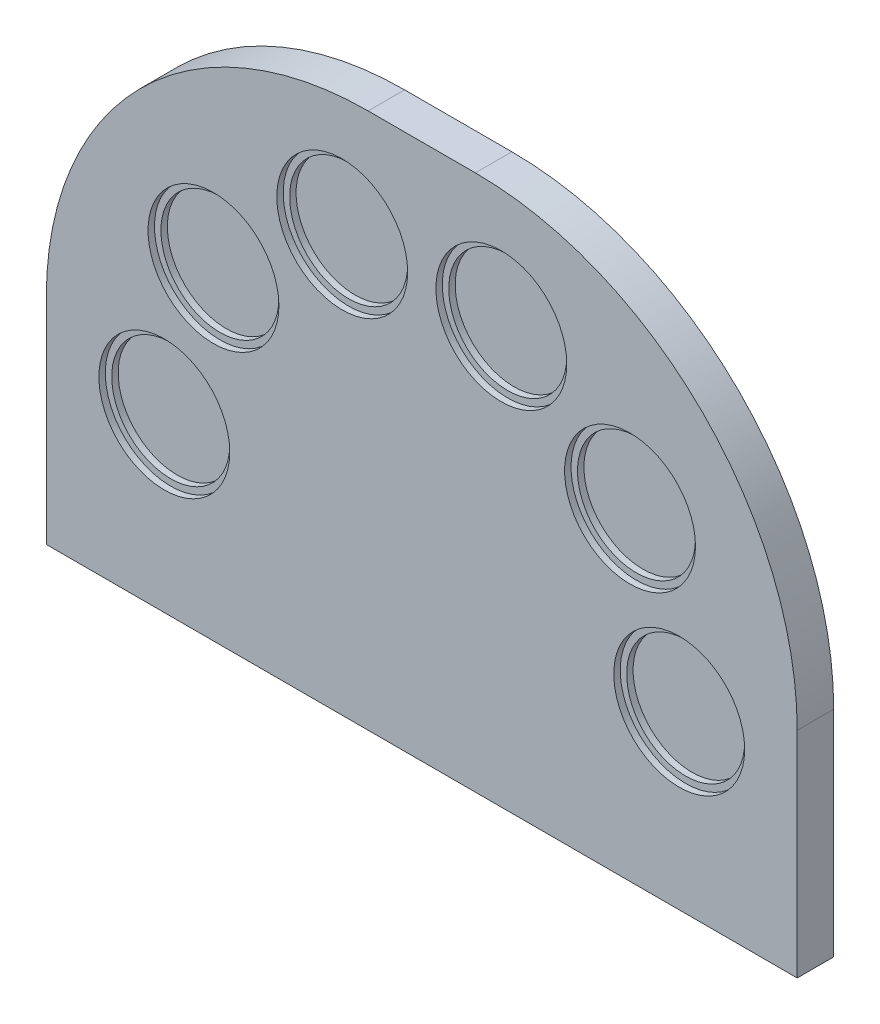
ISO-10303-21;
HEADER;
FILE_DESCRIPTION(('STEP AP214'),'2;1');
FILE_NAME('part.step','',(''),(''),'','','');
FILE_SCHEMA(('AUTOMOTIVE_DESIGN { 1 0 10303 214 1 1 1 1 }'));
ENDSEC;
DATA;
#1=APPLICATION_CONTEXT('core data for automotive mechanical design processes');
#2=APPLICATION_PROTOCOL_DEFINITION('international standard','automotive_design',2000,#1);
#3=PRODUCT_CONTEXT('',#1,'mechanical');
#4=PRODUCT('Part','Part','',(#3));
#5=PRODUCT_RELATED_PRODUCT_CATEGORY('part','',(#4));
#6=PRODUCT_DEFINITION_FORMATION('','',#4);
#7=PRODUCT_DEFINITION_CONTEXT('part definition',#1,'design');
#8=PRODUCT_DEFINITION('design','',#6,#7);
#9=PRODUCT_DEFINITION_SHAPE('','',#8);
#10=(LENGTH_UNIT() NAMED_UNIT(*) SI_UNIT(.MILLI.,.METRE.));
#11=(NAMED_UNIT(*) PLANE_ANGLE_UNIT() SI_UNIT($,.RADIAN.));
#12=(NAMED_UNIT(*) SI_UNIT($,.STERADIAN.) SOLID_ANGLE_UNIT());
#13=UNCERTAINTY_MEASURE_WITH_UNIT(LENGTH_MEASURE(1.E-05),#10,'distance_accuracy_value','');
#14=(GEOMETRIC_REPRESENTATION_CONTEXT(3) GLOBAL_UNCERTAINTY_ASSIGNED_CONTEXT((#13)) GLOBAL_UNIT_ASSIGNED_CONTEXT((#10,
#11,#12)) REPRESENTATION_CONTEXT('',''));
#15=CARTESIAN_POINT('',(0.,0.,0.));
#16=DIRECTION('',(0.,0.,1.));
#17=DIRECTION('',(1.,0.,0.));
#18=AXIS2_PLACEMENT_3D('',#15,#16,#17);
#19=CARTESIAN_POINT('',(0.,125.,14.));
#20=DIRECTION('',(-1.,0.,0.));
#21=DIRECTION('',(0.,0.,1.));
#22=AXIS2_PLACEMENT_3D('',#19,#20,#21);
#23=PLANE('',#22);
#24=DIRECTION('',(0.,0.,-1.));
#25=VECTOR('',#24,1.);
#26=CARTESIAN_POINT('',(0.,0.,14.));
#27=LINE('',#26,#25);
#28=CARTESIAN_POINT('',(0.,0.,17.));
#29=VERTEX_POINT('',#28);
#30=CARTESIAN_POINT('',(0.,0.,0.));
#31=VERTEX_POINT('',#30);
#32=EDGE_CURVE('E131',#29,#31,#27,.T.);
#33=ORIENTED_EDGE('',*,*,#32,.F.);
#34=DIRECTION('',(0.,1.,0.));
#35=VECTOR('',#34,1.);
#36=CARTESIAN_POINT('',(0.,125.,17.));
#37=LINE('',#36,#35);
#38=CARTESIAN_POINT('',(0.,100.,17.));
#39=VERTEX_POINT('',#38);
#40=EDGE_CURVE('E147',#29,#39,#37,.T.);
#41=ORIENTED_EDGE('',*,*,#40,.T.);
#42=DIRECTION('',(0.,0.,-1.));
#43=VECTOR('',#42,1.);
#44=CARTESIAN_POINT('',(0.,100.,14.));
#45=LINE('',#44,#43);
#46=CARTESIAN_POINT('',(0.,100.,0.));
#47=VERTEX_POINT('',#46);
#48=EDGE_CURVE('E10',#39,#47,#45,.T.);
#49=ORIENTED_EDGE('',*,*,#48,.T.);
#50=DIRECTION('',(0.,1.,0.));
#51=VECTOR('',#50,1.);
#52=CARTESIAN_POINT('',(0.,125.,0.));
#53=LINE('',#52,#51);
#54=EDGE_CURVE('E277',#31,#47,#53,.T.);
#55=ORIENTED_EDGE('',*,*,#54,.F.);
#56=EDGE_LOOP('',(#33,#41,#49,#55));
#57=FACE_BOUND('',#56,.T.);
#58=ADVANCED_FACE('F16',(#57),#23,.T.);
#59=CARTESIAN_POINT('',(175.,0.,14.));
#60=DIRECTION('',(0.,1.,0.));
#61=DIRECTION('',(0.,0.,1.));
#62=AXIS2_PLACEMENT_3D('',#59,#60,#61);
#63=PLANE('',#62);
#64=DIRECTION('',(1.,0.,0.));
#65=VECTOR('',#64,1.);
#66=CARTESIAN_POINT('',(175.,0.,0.));
#67=LINE('',#66,#65);
#68=CARTESIAN_POINT('',(350.,0.,0.));
#69=VERTEX_POINT('',#68);
#70=EDGE_CURVE('E126',#31,#69,#67,.T.);
#71=ORIENTED_EDGE('',*,*,#70,.T.);
#72=DIRECTION('',(0.,0.,-1.));
#73=VECTOR('',#72,1.);
#74=CARTESIAN_POINT('',(350.,0.,14.));
#75=LINE('',#74,#73);
#76=CARTESIAN_POINT('',(350.,0.,17.));
#77=VERTEX_POINT('',#76);
#78=EDGE_CURVE('E119',#77,#69,#75,.T.);
#79=ORIENTED_EDGE('',*,*,#78,.F.);
#80=DIRECTION('',(1.,0.,0.));
#81=VECTOR('',#80,1.);
#82=CARTESIAN_POINT('',(175.,0.,17.));
#83=LINE('',#82,#81);
#84=EDGE_CURVE('E123',#29,#77,#83,.T.);
#85=ORIENTED_EDGE('',*,*,#84,.F.);
#86=ORIENTED_EDGE('',*,*,#32,.T.);
#87=EDGE_LOOP('',(#71,#79,#85,#86));
#88=FACE_BOUND('',#87,.T.);
#89=ADVANCED_FACE('F121',(#88),#63,.F.);
#90=CARTESIAN_POINT('',(350.,125.,14.));
#91=DIRECTION('',(-1.,0.,0.));
#92=DIRECTION('',(0.,0.,1.));
#93=AXIS2_PLACEMENT_3D('',#90,#91,#92);
#94=PLANE('',#93);
#95=DIRECTION('',(0.,1.,0.));
#96=VECTOR('',#95,1.);
#97=CARTESIAN_POINT('',(350.,125.,0.));
#98=LINE('',#97,#96);
#99=CARTESIAN_POINT('',(350.,100.,0.));
#100=VERTEX_POINT('',#99);
#101=EDGE_CURVE('E286',#69,#100,#98,.T.);
#102=ORIENTED_EDGE('',*,*,#101,.T.);
#103=DIRECTION('',(0.,0.,-1.));
#104=VECTOR('',#103,1.);
#105=CARTESIAN_POINT('',(350.,100.,14.));
#106=LINE('',#105,#104);
#107=CARTESIAN_POINT('',(350.,100.,17.));
#108=VERTEX_POINT('',#107);
#109=EDGE_CURVE('E25',#100,#108,#106,.F.);
#110=ORIENTED_EDGE('',*,*,#109,.T.);
#111=DIRECTION('',(0.,1.,0.));
#112=VECTOR('',#111,1.);
#113=CARTESIAN_POINT('',(350.,125.,17.));
#114=LINE('',#113,#112);
#115=EDGE_CURVE('E135',#77,#108,#114,.T.);
#116=ORIENTED_EDGE('',*,*,#115,.F.);
#117=ORIENTED_EDGE('',*,*,#78,.T.);
#118=EDGE_LOOP('',(#102,#110,#116,#117));
#119=FACE_BOUND('',#118,.T.);
#120=ADVANCED_FACE('F136',(#119),#94,.F.);
#121=CARTESIAN_POINT('',(175.,250.,14.));
#122=DIRECTION('',(0.,1.,0.));
#123=DIRECTION('',(0.,0.,1.));
#124=AXIS2_PLACEMENT_3D('',#121,#122,#123);
#125=PLANE('',#124);
#126=DIRECTION('',(0.,0.,-1.));
#127=VECTOR('',#126,1.);
#128=CARTESIAN_POINT('',(150.,250.,14.));
#129=LINE('',#128,#127);
#130=CARTESIAN_POINT('',(150.,250.,0.));
#131=VERTEX_POINT('',#130);
#132=CARTESIAN_POINT('',(150.,250.,17.));
#133=VERTEX_POINT('',#132);
#134=EDGE_CURVE('E294',#131,#133,#129,.F.);
#135=ORIENTED_EDGE('',*,*,#134,.T.);
#136=DIRECTION('',(1.,0.,0.));
#137=VECTOR('',#136,1.);
#138=CARTESIAN_POINT('',(175.,250.,17.));
#139=LINE('',#138,#137);
#140=CARTESIAN_POINT('',(200.,250.,17.));
#141=VERTEX_POINT('',#140);
#142=EDGE_CURVE('E161',#133,#141,#139,.T.);
#143=ORIENTED_EDGE('',*,*,#142,.T.);
#144=DIRECTION('',(0.,0.,-1.));
#145=VECTOR('',#144,1.);
#146=CARTESIAN_POINT('',(200.,250.,0.));
#147=LINE('',#146,#145);
#148=CARTESIAN_POINT('',(200.,250.,0.));
#149=VERTEX_POINT('',#148);
#150=EDGE_CURVE('E297',#141,#149,#147,.T.);
#151=ORIENTED_EDGE('',*,*,#150,.T.);
#152=DIRECTION('',(1.,0.,0.));
#153=VECTOR('',#152,1.);
#154=CARTESIAN_POINT('',(175.,250.,0.));
#155=LINE('',#154,#153);
#156=EDGE_CURVE('E132',#131,#149,#155,.T.);
#157=ORIENTED_EDGE('',*,*,#156,.F.);
#158=EDGE_LOOP('',(#135,#143,#151,#157));
#159=FACE_BOUND('',#158,.T.);
#160=ADVANCED_FACE('F347',(#159),#125,.T.);
#161=CARTESIAN_POINT('',(175.,125.,0.));
#162=DIRECTION('',(0.,0.,1.));
#163=DIRECTION('',(1.,0.,0.));
#164=AXIS2_PLACEMENT_3D('',#161,#162,#163);
#165=PLANE('',#164);
#166=DIRECTION('',(0.,1.,0.));
#167=VECTOR('',#166,1.);
#168=CARTESIAN_POINT('',(279.,30.,0.));
#169=LINE('',#168,#167);
#170=CARTESIAN_POINT('',(279.,10.,0.));
#171=VERTEX_POINT('',#170);
#172=CARTESIAN_POINT('',(279.,50.,0.));
#173=VERTEX_POINT('',#172);
#174=EDGE_CURVE('E209',#171,#173,#169,.T.);
#175=ORIENTED_EDGE('',*,*,#174,.F.);
#176=DIRECTION('',(1.,0.,0.));
#177=VECTOR('',#176,1.);
#178=CARTESIAN_POINT('',(279.5,10.,0.));
#179=LINE('',#178,#177);
#180=CARTESIAN_POINT('',(280.,10.,0.));
#181=VERTEX_POINT('',#180);
#182=EDGE_CURVE('E37',#171,#181,#179,.T.);
#183=ORIENTED_EDGE('',*,*,#182,.T.);
#184=DIRECTION('',(0.,1.,0.));
#185=VECTOR('',#184,1.);
#186=CARTESIAN_POINT('',(280.,30.,0.));
#187=LINE('',#186,#185);
#188=CARTESIAN_POINT('',(280.,50.,0.));
#189=VERTEX_POINT('',#188);
#190=EDGE_CURVE('E45',#181,#189,#187,.T.);
#191=ORIENTED_EDGE('',*,*,#190,.T.);
#192=DIRECTION('',(1.,0.,0.));
#193=VECTOR('',#192,1.);
#194=CARTESIAN_POINT('',(279.5,50.,0.));
#195=LINE('',#194,#193);
#196=EDGE_CURVE('E213',#173,#189,#195,.T.);
#197=ORIENTED_EDGE('',*,*,#196,.F.);
#198=EDGE_LOOP('',(#175,#183,#191,#197));
#199=FACE_BOUND('',#198,.T.);
#200=ORIENTED_EDGE('',*,*,#156,.T.);
#201=CARTESIAN_POINT('',(200.,100.,0.));
#202=DIRECTION('',(0.,0.,1.));
#203=DIRECTION('',(1.,0.,0.));
#204=AXIS2_PLACEMENT_3D('',#201,#202,#203);
#205=CIRCLE('',#204,150.);
#206=EDGE_CURVE('E304',#149,#100,#205,.F.);
#207=ORIENTED_EDGE('',*,*,#206,.T.);
#208=ORIENTED_EDGE('',*,*,#101,.F.);
#209=ORIENTED_EDGE('',*,*,#70,.F.);
#210=ORIENTED_EDGE('',*,*,#54,.T.);
#211=CARTESIAN_POINT('',(150.,100.,0.));
#212=DIRECTION('',(0.,0.,1.));
#213=DIRECTION('',(1.,0.,0.));
#214=AXIS2_PLACEMENT_3D('',#211,#212,#213);
#215=CIRCLE('',#214,150.);
#216=EDGE_CURVE('E301',#47,#131,#215,.F.);
#217=ORIENTED_EDGE('',*,*,#216,.T.);
#218=EDGE_LOOP('',(#200,#207,#208,#209,#210,#217));
#219=FACE_BOUND('',#218,.T.);
#220=ADVANCED_FACE('F342',(#199,#219),#165,.F.);
#221=CARTESIAN_POINT('',(200.,100.,14.));
#222=DIRECTION('',(0.,0.,1.));
#223=DIRECTION('',(1.,0.,0.));
#224=AXIS2_PLACEMENT_3D('',#221,#222,#223);
#225=CYLINDRICAL_SURFACE('',#224,150.);
#226=ORIENTED_EDGE('',*,*,#150,.F.);
#227=CARTESIAN_POINT('',(200.,100.,17.));
#228=DIRECTION('',(0.,0.,1.));
#229=DIRECTION('',(1.,0.,0.));
#230=AXIS2_PLACEMENT_3D('',#227,#228,#229);
#231=CIRCLE('',#230,150.);
#232=EDGE_CURVE('E142',#108,#141,#231,.T.);
#233=ORIENTED_EDGE('',*,*,#232,.F.);
#234=ORIENTED_EDGE('',*,*,#109,.F.);
#235=ORIENTED_EDGE('',*,*,#206,.F.);
#236=EDGE_LOOP('',(#226,#233,#234,#235));
#237=FACE_BOUND('',#236,.T.);
#238=ADVANCED_FACE('F333',(#237),#225,.T.);
#239=CARTESIAN_POINT('',(150.,100.,14.));
#240=DIRECTION('',(0.,0.,-1.));
#241=DIRECTION('',(-1.,0.,0.));
#242=AXIS2_PLACEMENT_3D('',#239,#240,#241);
#243=CYLINDRICAL_SURFACE('',#242,150.);
#244=ORIENTED_EDGE('',*,*,#48,.F.);
#245=CARTESIAN_POINT('',(150.,100.,17.));
#246=DIRECTION('',(0.,0.,1.));
#247=DIRECTION('',(1.,0.,0.));
#248=AXIS2_PLACEMENT_3D('',#245,#246,#247);
#249=CIRCLE('',#248,150.);
#250=EDGE_CURVE('E165',#133,#39,#249,.T.);
#251=ORIENTED_EDGE('',*,*,#250,.F.);
#252=ORIENTED_EDGE('',*,*,#134,.F.);
#253=ORIENTED_EDGE('',*,*,#216,.F.);
#254=EDGE_LOOP('',(#244,#251,#252,#253));
#255=FACE_BOUND('',#254,.T.);
#256=ADVANCED_FACE('F18',(#255),#243,.T.);
#257=CARTESIAN_POINT('',(279.5,10.,-50.));
#258=DIRECTION('',(0.,-1.,0.));
#259=DIRECTION('',(0.,0.,-1.));
#260=AXIS2_PLACEMENT_3D('',#257,#258,#259);
#261=PLANE('',#260);
#262=ORIENTED_EDGE('',*,*,#182,.F.);
#263=DIRECTION('',(0.,0.,1.));
#264=VECTOR('',#263,1.);
#265=CARTESIAN_POINT('',(279.,10.,-50.));
#266=LINE('',#265,#264);
#267=CARTESIAN_POINT('',(279.,10.,-50.));
#268=VERTEX_POINT('',#267);
#269=EDGE_CURVE('E228',#268,#171,#266,.T.);
#270=ORIENTED_EDGE('',*,*,#269,.F.);
#271=DIRECTION('',(1.,0.,0.));
#272=VECTOR('',#271,1.);
#273=CARTESIAN_POINT('',(279.5,10.,-50.));
#274=LINE('',#273,#272);
#275=CARTESIAN_POINT('',(280.,10.,-50.));
#276=VERTEX_POINT('',#275);
#277=EDGE_CURVE('E193',#268,#276,#274,.T.);
#278=ORIENTED_EDGE('',*,*,#277,.T.);
#279=DIRECTION('',(0.,0.,1.));
#280=VECTOR('',#279,1.);
#281=CARTESIAN_POINT('',(280.,10.,-50.));
#282=LINE('',#281,#280);
#283=EDGE_CURVE('E207',#276,#181,#282,.T.);
#284=ORIENTED_EDGE('',*,*,#283,.T.);
#285=EDGE_LOOP('',(#262,#270,#278,#284));
#286=FACE_BOUND('',#285,.T.);
#287=ADVANCED_FACE('F332',(#286),#261,.T.);
#288=CARTESIAN_POINT('',(279.,30.,-50.));
#289=DIRECTION('',(1.,0.,0.));
#290=DIRECTION('',(0.,0.,-1.));
#291=AXIS2_PLACEMENT_3D('',#288,#289,#290);
#292=PLANE('',#291);
#293=ORIENTED_EDGE('',*,*,#174,.T.);
#294=DIRECTION('',(0.,0.,1.));
#295=VECTOR('',#294,1.);
#296=CARTESIAN_POINT('',(279.,50.,-50.));
#297=LINE('',#296,#295);
#298=CARTESIAN_POINT('',(279.,50.,-50.));
#299=VERTEX_POINT('',#298);
#300=EDGE_CURVE('E224',#299,#173,#297,.T.);
#301=ORIENTED_EDGE('',*,*,#300,.F.);
#302=DIRECTION('',(0.,1.,0.));
#303=VECTOR('',#302,1.);
#304=CARTESIAN_POINT('',(279.,30.,-50.));
#305=LINE('',#304,#303);
#306=EDGE_CURVE('E197',#268,#299,#305,.T.);
#307=ORIENTED_EDGE('',*,*,#306,.F.);
#308=ORIENTED_EDGE('',*,*,#269,.T.);
#309=EDGE_LOOP('',(#293,#301,#307,#308));
#310=FACE_BOUND('',#309,.T.);
#311=ADVANCED_FACE('F582',(#310),#292,.F.);
#312=CARTESIAN_POINT('',(279.5,50.,-50.));
#313=DIRECTION('',(0.,-1.,0.));
#314=DIRECTION('',(0.,0.,-1.));
#315=AXIS2_PLACEMENT_3D('',#312,#313,#314);
#316=PLANE('',#315);
#317=ORIENTED_EDGE('',*,*,#196,.T.);
#318=DIRECTION('',(0.,0.,1.));
#319=VECTOR('',#318,1.);
#320=CARTESIAN_POINT('',(280.,50.,-50.));
#321=LINE('',#320,#319);
#322=CARTESIAN_POINT('',(280.,50.,-50.));
#323=VERTEX_POINT('',#322);
#324=EDGE_CURVE('E221',#323,#189,#321,.T.);
#325=ORIENTED_EDGE('',*,*,#324,.F.);
#326=DIRECTION('',(1.,0.,0.));
#327=VECTOR('',#326,1.);
#328=CARTESIAN_POINT('',(279.5,50.,-50.));
#329=LINE('',#328,#327);
#330=EDGE_CURVE('E200',#299,#323,#329,.T.);
#331=ORIENTED_EDGE('',*,*,#330,.F.);
#332=ORIENTED_EDGE('',*,*,#300,.T.);
#333=EDGE_LOOP('',(#317,#325,#331,#332));
#334=FACE_BOUND('',#333,.T.);
#335=ADVANCED_FACE('F591',(#334),#316,.F.);
#336=CARTESIAN_POINT('',(280.,30.,-50.));
#337=DIRECTION('',(1.,0.,0.));
#338=DIRECTION('',(0.,0.,-1.));
#339=AXIS2_PLACEMENT_3D('',#336,#337,#338);
#340=PLANE('',#339);
#341=ORIENTED_EDGE('',*,*,#190,.F.);
#342=ORIENTED_EDGE('',*,*,#283,.F.);
#343=DIRECTION('',(0.,1.,0.));
#344=VECTOR('',#343,1.);
#345=CARTESIAN_POINT('',(280.,30.,-50.));
#346=LINE('',#345,#344);
#347=EDGE_CURVE('E203',#276,#323,#346,.T.);
#348=ORIENTED_EDGE('',*,*,#347,.T.);
#349=ORIENTED_EDGE('',*,*,#324,.T.);
#350=EDGE_LOOP('',(#341,#342,#348,#349));
#351=FACE_BOUND('',#350,.T.);
#352=ADVANCED_FACE('F600',(#351),#340,.T.);
#353=CARTESIAN_POINT('',(175.,125.,-50.));
#354=DIRECTION('',(0.,0.,-1.));
#355=DIRECTION('',(1.,0.,0.));
#356=AXIS2_PLACEMENT_3D('',#353,#354,#355);
#357=PLANE('',#356);
#358=ORIENTED_EDGE('',*,*,#277,.F.);
#359=ORIENTED_EDGE('',*,*,#306,.T.);
#360=ORIENTED_EDGE('',*,*,#330,.T.);
#361=ORIENTED_EDGE('',*,*,#347,.F.);
#362=EDGE_LOOP('',(#358,#359,#360,#361));
#363=FACE_BOUND('',#362,.T.);
#364=ADVANCED_FACE('F609',(#363),#357,.T.);
#365=CARTESIAN_POINT('',(295.,80.,17.));
#366=DIRECTION('',(0.,0.,-1.));
#367=DIRECTION('',(-1.,0.,0.));
#368=AXIS2_PLACEMENT_3D('',#365,#366,#367);
#369=CYLINDRICAL_SURFACE('',#368,30.5);
#370=CARTESIAN_POINT('',(295.,80.,17.));
#371=DIRECTION('',(0.,0.,1.));
#372=DIRECTION('',(1.,0.,0.));
#373=AXIS2_PLACEMENT_3D('',#370,#371,#372);
#374=CIRCLE('',#373,30.5);
#375=CARTESIAN_POINT('',(325.5,80.,17.));
#376=VERTEX_POINT('',#375);
#377=EDGE_CURVE('E149',#376,#376,#374,.T.);
#378=ORIENTED_EDGE('',*,*,#377,.T.);
#379=EDGE_LOOP('',(#378));
#380=FACE_BOUND('',#379,.T.);
#381=CARTESIAN_POINT('',(295.,80.,14.));
#382=DIRECTION('',(0.,0.,1.));
#383=DIRECTION('',(1.,0.,0.));
#384=AXIS2_PLACEMENT_3D('',#381,#382,#383);
#385=CIRCLE('',#384,30.5);
#386=CARTESIAN_POINT('',(325.5,80.,14.));
#387=VERTEX_POINT('',#386);
#388=EDGE_CURVE('E188',#387,#387,#385,.T.);
#389=ORIENTED_EDGE('',*,*,#388,.F.);
#390=EDGE_LOOP('',(#389));
#391=FACE_BOUND('',#390,.T.);
#392=ADVANCED_FACE('F617',(#380,#391),#369,.F.);
#393=CARTESIAN_POINT('',(272.082039324994,150.534230275097,17.));
#394=DIRECTION('',(0.,0.,-1.));
#395=DIRECTION('',(-1.,0.,0.));
#396=AXIS2_PLACEMENT_3D('',#393,#394,#395);
#397=CYLINDRICAL_SURFACE('',#396,30.5);
#398=CARTESIAN_POINT('',(272.082039324994,150.534230275097,17.));
#399=DIRECTION('',(0.,0.,1.));
#400=DIRECTION('',(1.,0.,0.));
#401=AXIS2_PLACEMENT_3D('',#398,#399,#400);
#402=CIRCLE('',#401,30.5);
#403=CARTESIAN_POINT('',(302.582039324994,150.534230275097,17.));
#404=VERTEX_POINT('',#403);
#405=EDGE_CURVE('E155',#404,#404,#402,.T.);
#406=ORIENTED_EDGE('',*,*,#405,.T.);
#407=EDGE_LOOP('',(#406));
#408=FACE_BOUND('',#407,.T.);
#409=CARTESIAN_POINT('',(272.082039324994,150.534230275097,14.));
#410=DIRECTION('',(0.,0.,1.));
#411=DIRECTION('',(1.,0.,0.));
#412=AXIS2_PLACEMENT_3D('',#409,#410,#411);
#413=CIRCLE('',#412,30.5);
#414=CARTESIAN_POINT('',(302.582039324994,150.534230275097,14.));
#415=VERTEX_POINT('',#414);
#416=EDGE_CURVE('E184',#415,#415,#413,.T.);
#417=ORIENTED_EDGE('',*,*,#416,.F.);
#418=EDGE_LOOP('',(#417));
#419=FACE_BOUND('',#418,.T.);
#420=ADVANCED_FACE('F631',(#408,#419),#397,.F.);
#421=CARTESIAN_POINT('',(212.082039324994,194.126781955418,17.));
#422=DIRECTION('',(0.,0.,-1.));
#423=DIRECTION('',(-1.,0.,0.));
#424=AXIS2_PLACEMENT_3D('',#421,#422,#423);
#425=CYLINDRICAL_SURFACE('',#424,30.5);
#426=CARTESIAN_POINT('',(212.082039324994,194.126781955418,17.));
#427=DIRECTION('',(0.,0.,1.));
#428=DIRECTION('',(1.,0.,0.));
#429=AXIS2_PLACEMENT_3D('',#426,#427,#428);
#430=CIRCLE('',#429,30.5);
#431=CARTESIAN_POINT('',(242.582039324994,194.126781955418,17.));
#432=VERTEX_POINT('',#431);
#433=EDGE_CURVE('E771',#432,#432,#430,.T.);
#434=ORIENTED_EDGE('',*,*,#433,.T.);
#435=EDGE_LOOP('',(#434));
#436=FACE_BOUND('',#435,.T.);
#437=CARTESIAN_POINT('',(212.082039324994,194.126781955418,14.));
#438=DIRECTION('',(0.,0.,1.));
#439=DIRECTION('',(1.,0.,0.));
#440=AXIS2_PLACEMENT_3D('',#437,#438,#439);
#441=CIRCLE('',#440,30.5);
#442=CARTESIAN_POINT('',(242.582039324994,194.126781955418,14.));
#443=VERTEX_POINT('',#442);
#444=EDGE_CURVE('E180',#443,#443,#441,.T.);
#445=ORIENTED_EDGE('',*,*,#444,.F.);
#446=EDGE_LOOP('',(#445));
#447=FACE_BOUND('',#446,.T.);
#448=ADVANCED_FACE('F642',(#436,#447),#425,.F.);
#449=CARTESIAN_POINT('',(137.917960675006,194.126781955418,17.));
#450=DIRECTION('',(0.,0.,-1.));
#451=DIRECTION('',(-1.,0.,0.));
#452=AXIS2_PLACEMENT_3D('',#449,#450,#451);
#453=CYLINDRICAL_SURFACE('',#452,30.5);
#454=CARTESIAN_POINT('',(137.917960675006,194.126781955418,17.));
#455=DIRECTION('',(0.,0.,1.));
#456=DIRECTION('',(1.,0.,0.));
#457=AXIS2_PLACEMENT_3D('',#454,#455,#456);
#458=CIRCLE('',#457,30.5);
#459=CARTESIAN_POINT('',(168.417960675006,194.126781955418,17.));
#460=VERTEX_POINT('',#459);
#461=EDGE_CURVE('E775',#460,#460,#458,.T.);
#462=ORIENTED_EDGE('',*,*,#461,.T.);
#463=EDGE_LOOP('',(#462));
#464=FACE_BOUND('',#463,.T.);
#465=CARTESIAN_POINT('',(137.917960675006,194.126781955418,14.));
#466=DIRECTION('',(0.,0.,1.));
#467=DIRECTION('',(1.,0.,0.));
#468=AXIS2_PLACEMENT_3D('',#465,#466,#467);
#469=CIRCLE('',#468,30.5);
#470=CARTESIAN_POINT('',(168.417960675006,194.126781955418,14.));
#471=VERTEX_POINT('',#470);
#472=EDGE_CURVE('E176',#471,#471,#469,.T.);
#473=ORIENTED_EDGE('',*,*,#472,.F.);
#474=EDGE_LOOP('',(#473));
#475=FACE_BOUND('',#474,.T.);
#476=ADVANCED_FACE('F653',(#464,#475),#453,.F.);
#477=CARTESIAN_POINT('',(55.,80.,17.));
#478=DIRECTION('',(0.,0.,-1.));
#479=DIRECTION('',(-1.,0.,0.));
#480=AXIS2_PLACEMENT_3D('',#477,#478,#479);
#481=CYLINDRICAL_SURFACE('',#480,30.5);
#482=CARTESIAN_POINT('',(55.,80.,17.));
#483=DIRECTION('',(0.,0.,1.));
#484=DIRECTION('',(1.,0.,0.));
#485=AXIS2_PLACEMENT_3D('',#482,#483,#484);
#486=CIRCLE('',#485,30.5);
#487=CARTESIAN_POINT('',(85.5,80.,17.));
#488=VERTEX_POINT('',#487);
#489=EDGE_CURVE('E780',#488,#488,#486,.T.);
#490=ORIENTED_EDGE('',*,*,#489,.T.);
#491=EDGE_LOOP('',(#490));
#492=FACE_BOUND('',#491,.T.);
#493=CARTESIAN_POINT('',(55.,80.,14.));
#494=DIRECTION('',(0.,0.,1.));
#495=DIRECTION('',(1.,0.,0.));
#496=AXIS2_PLACEMENT_3D('',#493,#494,#495);
#497=CIRCLE('',#496,30.5);
#498=CARTESIAN_POINT('',(85.5,80.,14.));
#499=VERTEX_POINT('',#498);
#500=EDGE_CURVE('E172',#499,#499,#497,.T.);
#501=ORIENTED_EDGE('',*,*,#500,.F.);
#502=EDGE_LOOP('',(#501));
#503=FACE_BOUND('',#502,.T.);
#504=ADVANCED_FACE('F664',(#492,#503),#481,.F.);
#505=CARTESIAN_POINT('',(77.9179606750063,150.534230275097,17.));
#506=DIRECTION('',(0.,0.,-1.));
#507=DIRECTION('',(-1.,0.,0.));
#508=AXIS2_PLACEMENT_3D('',#505,#506,#507);
#509=CYLINDRICAL_SURFACE('',#508,30.5);
#510=CARTESIAN_POINT('',(77.9179606750063,150.534230275097,17.));
#511=DIRECTION('',(0.,0.,1.));
#512=DIRECTION('',(1.,0.,0.));
#513=AXIS2_PLACEMENT_3D('',#510,#511,#512);
#514=CIRCLE('',#513,30.5);
#515=CARTESIAN_POINT('',(108.417960675006,150.534230275097,17.));
#516=VERTEX_POINT('',#515);
#517=EDGE_CURVE('E192',#516,#516,#514,.T.);
#518=ORIENTED_EDGE('',*,*,#517,.T.);
#519=EDGE_LOOP('',(#518));
#520=FACE_BOUND('',#519,.T.);
#521=CARTESIAN_POINT('',(77.9179606750063,150.534230275097,14.));
#522=DIRECTION('',(0.,0.,1.));
#523=DIRECTION('',(1.,0.,0.));
#524=AXIS2_PLACEMENT_3D('',#521,#522,#523);
#525=CIRCLE('',#524,30.5);
#526=CARTESIAN_POINT('',(108.417960675006,150.534230275097,14.));
#527=VERTEX_POINT('',#526);
#528=EDGE_CURVE('E168',#527,#527,#525,.T.);
#529=ORIENTED_EDGE('',*,*,#528,.F.);
#530=EDGE_LOOP('',(#529));
#531=FACE_BOUND('',#530,.T.);
#532=ADVANCED_FACE('F675',(#520,#531),#509,.F.);
#533=CARTESIAN_POINT('',(175.,125.,17.));
#534=DIRECTION('',(0.,0.,1.));
#535=DIRECTION('',(1.,0.,0.));
#536=AXIS2_PLACEMENT_3D('',#533,#534,#535);
#537=PLANE('',#536);
#538=ORIENTED_EDGE('',*,*,#517,.F.);
#539=EDGE_LOOP('',(#538));
#540=FACE_BOUND('',#539,.T.);
#541=ORIENTED_EDGE('',*,*,#489,.F.);
#542=EDGE_LOOP('',(#541));
#543=FACE_BOUND('',#542,.T.);
#544=ORIENTED_EDGE('',*,*,#461,.F.);
#545=EDGE_LOOP('',(#544));
#546=FACE_BOUND('',#545,.T.);
#547=ORIENTED_EDGE('',*,*,#433,.F.);
#548=EDGE_LOOP('',(#547));
#549=FACE_BOUND('',#548,.T.);
#550=ORIENTED_EDGE('',*,*,#405,.F.);
#551=EDGE_LOOP('',(#550));
#552=FACE_BOUND('',#551,.T.);
#553=ORIENTED_EDGE('',*,*,#377,.F.);
#554=EDGE_LOOP('',(#553));
#555=FACE_BOUND('',#554,.T.);
#556=ORIENTED_EDGE('',*,*,#84,.T.);
#557=ORIENTED_EDGE('',*,*,#115,.T.);
#558=ORIENTED_EDGE('',*,*,#232,.T.);
#559=ORIENTED_EDGE('',*,*,#142,.F.);
#560=ORIENTED_EDGE('',*,*,#250,.T.);
#561=ORIENTED_EDGE('',*,*,#40,.F.);
#562=EDGE_LOOP('',(#556,#557,#558,#559,#560,#561));
#563=FACE_BOUND('',#562,.T.);
#564=ADVANCED_FACE('F144',(#540,#543,#546,#549,#552,#555,#563),#537,.T.);
#565=CARTESIAN_POINT('',(175.,125.,11.));
#566=DIRECTION('',(0.,0.,1.));
#567=DIRECTION('',(1.,0.,0.));
#568=AXIS2_PLACEMENT_3D('',#565,#566,#567);
#569=PLANE('',#568);
#570=CARTESIAN_POINT('',(272.082039324994,150.534230275097,11.));
#571=DIRECTION('',(0.,0.,-1.));
#572=DIRECTION('',(1.,0.,0.));
#573=AXIS2_PLACEMENT_3D('',#570,#571,#572);
#574=CIRCLE('',#573,27.5);
#575=CARTESIAN_POINT('',(299.582039324994,150.534230275097,11.));
#576=VERTEX_POINT('',#575);
#577=EDGE_CURVE('E266',#576,#576,#574,.T.);
#578=ORIENTED_EDGE('',*,*,#577,.F.);
#579=EDGE_LOOP('',(#578));
#580=FACE_BOUND('',#579,.T.);
#581=ADVANCED_FACE('F542',(#580),#569,.T.);
#582=CARTESIAN_POINT('',(272.082039324994,150.534230275097,11.));
#583=DIRECTION('',(0.,0.,1.));
#584=DIRECTION('',(1.,0.,0.));
#585=AXIS2_PLACEMENT_3D('',#582,#583,#584);
#586=CYLINDRICAL_SURFACE('',#585,27.5);
#587=ORIENTED_EDGE('',*,*,#577,.T.);
#588=EDGE_LOOP('',(#587));
#589=FACE_BOUND('',#588,.T.);
#590=CARTESIAN_POINT('',(272.082039324994,150.534230275097,14.));
#591=DIRECTION('',(0.,0.,-1.));
#592=DIRECTION('',(1.,0.,0.));
#593=AXIS2_PLACEMENT_3D('',#590,#591,#592);
#594=CIRCLE('',#593,27.5);
#595=CARTESIAN_POINT('',(299.582039324994,150.534230275097,14.));
#596=VERTEX_POINT('',#595);
#597=EDGE_CURVE('E237',#596,#596,#594,.T.);
#598=ORIENTED_EDGE('',*,*,#597,.F.);
#599=EDGE_LOOP('',(#598));
#600=FACE_BOUND('',#599,.T.);
#601=ADVANCED_FACE('F423',(#589,#600),#586,.F.);
#602=CARTESIAN_POINT('',(175.,125.,14.));
#603=DIRECTION('',(0.,0.,1.));
#604=DIRECTION('',(1.,0.,0.));
#605=AXIS2_PLACEMENT_3D('',#602,#603,#604);
#606=PLANE('',#605);
#607=ORIENTED_EDGE('',*,*,#597,.T.);
#608=EDGE_LOOP('',(#607));
#609=FACE_BOUND('',#608,.T.);
#610=ORIENTED_EDGE('',*,*,#416,.T.);
#611=EDGE_LOOP('',(#610));
#612=FACE_BOUND('',#611,.T.);
#613=ADVANCED_FACE('F414',(#609,#612),#606,.T.);
#614=CARTESIAN_POINT('',(175.,125.,11.));
#615=DIRECTION('',(0.,0.,1.));
#616=DIRECTION('',(1.,0.,0.));
#617=AXIS2_PLACEMENT_3D('',#614,#615,#616);
#618=PLANE('',#617);
#619=CARTESIAN_POINT('',(212.082039324994,194.126781955418,11.));
#620=DIRECTION('',(0.,0.,-1.));
#621=DIRECTION('',(1.,0.,0.));
#622=AXIS2_PLACEMENT_3D('',#619,#620,#621);
#623=CIRCLE('',#622,27.5);
#624=CARTESIAN_POINT('',(239.582039324994,194.126781955418,11.));
#625=VERTEX_POINT('',#624);
#626=EDGE_CURVE('E233',#625,#625,#623,.T.);
#627=ORIENTED_EDGE('',*,*,#626,.F.);
#628=EDGE_LOOP('',(#627));
#629=FACE_BOUND('',#628,.T.);
#630=ADVANCED_FACE('F422',(#629),#618,.T.);
#631=CARTESIAN_POINT('',(212.082039324994,194.126781955418,11.));
#632=DIRECTION('',(0.,0.,1.));
#633=DIRECTION('',(1.,0.,0.));
#634=AXIS2_PLACEMENT_3D('',#631,#632,#633);
#635=CYLINDRICAL_SURFACE('',#634,27.5);
#636=ORIENTED_EDGE('',*,*,#626,.T.);
#637=EDGE_LOOP('',(#636));
#638=FACE_BOUND('',#637,.T.);
#639=CARTESIAN_POINT('',(212.082039324994,194.126781955418,14.));
#640=DIRECTION('',(0.,0.,-1.));
#641=DIRECTION('',(1.,0.,0.));
#642=AXIS2_PLACEMENT_3D('',#639,#640,#641);
#643=CIRCLE('',#642,27.5);
#644=CARTESIAN_POINT('',(239.582039324994,194.126781955418,14.));
#645=VERTEX_POINT('',#644);
#646=EDGE_CURVE('E232',#645,#645,#643,.T.);
#647=ORIENTED_EDGE('',*,*,#646,.F.);
#648=EDGE_LOOP('',(#647));
#649=FACE_BOUND('',#648,.T.);
#650=ADVANCED_FACE('F433',(#638,#649),#635,.F.);
#651=ORIENTED_EDGE('',*,*,#646,.T.);
#652=EDGE_LOOP('',(#651));
#653=FACE_BOUND('',#652,.T.);
#654=ORIENTED_EDGE('',*,*,#444,.T.);
#655=EDGE_LOOP('',(#654));
#656=FACE_BOUND('',#655,.T.);
#657=ADVANCED_FACE('F403',(#653,#656),#606,.T.);
#658=CARTESIAN_POINT('',(175.,125.,11.));
#659=DIRECTION('',(0.,0.,1.));
#660=DIRECTION('',(1.,0.,0.));
#661=AXIS2_PLACEMENT_3D('',#658,#659,#660);
#662=PLANE('',#661);
#663=CARTESIAN_POINT('',(137.917960675006,194.126781955418,11.));
#664=DIRECTION('',(0.,0.,1.));
#665=DIRECTION('',(1.,0.,0.));
#666=AXIS2_PLACEMENT_3D('',#663,#664,#665);
#667=CIRCLE('',#666,27.5);
#668=CARTESIAN_POINT('',(165.417960675006,194.126781955418,11.));
#669=VERTEX_POINT('',#668);
#670=EDGE_CURVE('E250',#669,#669,#667,.T.);
#671=ORIENTED_EDGE('',*,*,#670,.T.);
#672=EDGE_LOOP('',(#671));
#673=FACE_BOUND('',#672,.T.);
#674=ADVANCED_FACE('F432',(#673),#662,.T.);
#675=CARTESIAN_POINT('',(137.917960675006,194.126781955418,11.));
#676=DIRECTION('',(0.,0.,1.));
#677=DIRECTION('',(1.,0.,0.));
#678=AXIS2_PLACEMENT_3D('',#675,#676,#677);
#679=CYLINDRICAL_SURFACE('',#678,27.5);
#680=ORIENTED_EDGE('',*,*,#670,.F.);
#681=EDGE_LOOP('',(#680));
#682=FACE_BOUND('',#681,.T.);
#683=CARTESIAN_POINT('',(137.917960675006,194.126781955418,14.));
#684=DIRECTION('',(0.,0.,1.));
#685=DIRECTION('',(1.,0.,0.));
#686=AXIS2_PLACEMENT_3D('',#683,#684,#685);
#687=CIRCLE('',#686,27.5);
#688=CARTESIAN_POINT('',(165.417960675006,194.126781955418,14.));
#689=VERTEX_POINT('',#688);
#690=EDGE_CURVE('E254',#689,#689,#687,.T.);
#691=ORIENTED_EDGE('',*,*,#690,.T.);
#692=EDGE_LOOP('',(#691));
#693=FACE_BOUND('',#692,.T.);
#694=ADVANCED_FACE('F401',(#682,#693),#679,.F.);
#695=ORIENTED_EDGE('',*,*,#690,.F.);
#696=EDGE_LOOP('',(#695));
#697=FACE_BOUND('',#696,.T.);
#698=ORIENTED_EDGE('',*,*,#472,.T.);
#699=EDGE_LOOP('',(#698));
#700=FACE_BOUND('',#699,.T.);
#701=ADVANCED_FACE('F378',(#697,#700),#606,.T.);
#702=CARTESIAN_POINT('',(175.,125.,11.));
#703=DIRECTION('',(0.,0.,1.));
#704=DIRECTION('',(1.,0.,0.));
#705=AXIS2_PLACEMENT_3D('',#702,#703,#704);
#706=PLANE('',#705);
#707=CARTESIAN_POINT('',(55.,80.,11.));
#708=DIRECTION('',(0.,0.,1.));
#709=DIRECTION('',(1.,0.,0.));
#710=AXIS2_PLACEMENT_3D('',#707,#708,#709);
#711=CIRCLE('',#710,27.5);
#712=CARTESIAN_POINT('',(82.5,80.,11.));
#713=VERTEX_POINT('',#712);
#714=EDGE_CURVE('E273',#713,#713,#711,.T.);
#715=ORIENTED_EDGE('',*,*,#714,.T.);
#716=EDGE_LOOP('',(#715));
#717=FACE_BOUND('',#716,.T.);
#718=ADVANCED_FACE('F400',(#717),#706,.T.);
#719=CARTESIAN_POINT('',(55.,80.,11.));
#720=DIRECTION('',(0.,0.,1.));
#721=DIRECTION('',(1.,0.,0.));
#722=AXIS2_PLACEMENT_3D('',#719,#720,#721);
#723=CYLINDRICAL_SURFACE('',#722,27.5);
#724=ORIENTED_EDGE('',*,*,#714,.F.);
#725=EDGE_LOOP('',(#724));
#726=FACE_BOUND('',#725,.T.);
#727=CARTESIAN_POINT('',(55.,80.,14.));
#728=DIRECTION('',(0.,0.,1.));
#729=DIRECTION('',(1.,0.,0.));
#730=AXIS2_PLACEMENT_3D('',#727,#728,#729);
#731=CIRCLE('',#730,27.5);
#732=CARTESIAN_POINT('',(82.5,80.,14.));
#733=VERTEX_POINT('',#732);
#734=EDGE_CURVE('E245',#733,#733,#731,.T.);
#735=ORIENTED_EDGE('',*,*,#734,.T.);
#736=EDGE_LOOP('',(#735));
#737=FACE_BOUND('',#736,.T.);
#738=ADVANCED_FACE('F375',(#726,#737),#723,.F.);
#739=ORIENTED_EDGE('',*,*,#734,.F.);
#740=EDGE_LOOP('',(#739));
#741=FACE_BOUND('',#740,.T.);
#742=ORIENTED_EDGE('',*,*,#500,.T.);
#743=EDGE_LOOP('',(#742));
#744=FACE_BOUND('',#743,.T.);
#745=ADVANCED_FACE('F369',(#741,#744),#606,.T.);
#746=CARTESIAN_POINT('',(175.,125.,11.));
#747=DIRECTION('',(0.,0.,1.));
#748=DIRECTION('',(1.,0.,0.));
#749=AXIS2_PLACEMENT_3D('',#746,#747,#748);
#750=PLANE('',#749);
#751=CARTESIAN_POINT('',(77.9179606750063,150.534230275097,11.));
#752=DIRECTION('',(0.,0.,1.));
#753=DIRECTION('',(1.,0.,0.));
#754=AXIS2_PLACEMENT_3D('',#751,#752,#753);
#755=CIRCLE('',#754,27.5);
#756=CARTESIAN_POINT('',(105.417960675006,150.534230275097,11.));
#757=VERTEX_POINT('',#756);
#758=EDGE_CURVE('E241',#757,#757,#755,.T.);
#759=ORIENTED_EDGE('',*,*,#758,.T.);
#760=EDGE_LOOP('',(#759));
#761=FACE_BOUND('',#760,.T.);
#762=ADVANCED_FACE('F374',(#761),#750,.T.);
#763=CARTESIAN_POINT('',(77.9179606750063,150.534230275097,11.));
#764=DIRECTION('',(0.,0.,1.));
#765=DIRECTION('',(1.,0.,0.));
#766=AXIS2_PLACEMENT_3D('',#763,#764,#765);
#767=CYLINDRICAL_SURFACE('',#766,27.5);
#768=ORIENTED_EDGE('',*,*,#758,.F.);
#769=EDGE_LOOP('',(#768));
#770=FACE_BOUND('',#769,.T.);
#771=CARTESIAN_POINT('',(77.9179606750063,150.534230275097,14.));
#772=DIRECTION('',(0.,0.,1.));
#773=DIRECTION('',(1.,0.,0.));
#774=AXIS2_PLACEMENT_3D('',#771,#772,#773);
#775=CIRCLE('',#774,27.5);
#776=CARTESIAN_POINT('',(105.417960675006,150.534230275097,14.));
#777=VERTEX_POINT('',#776);
#778=EDGE_CURVE('E246',#777,#777,#775,.T.);
#779=ORIENTED_EDGE('',*,*,#778,.T.);
#780=EDGE_LOOP('',(#779));
#781=FACE_BOUND('',#780,.T.);
#782=ADVANCED_FACE('F389',(#770,#781),#767,.F.);
#783=ORIENTED_EDGE('',*,*,#778,.F.);
#784=EDGE_LOOP('',(#783));
#785=FACE_BOUND('',#784,.T.);
#786=ORIENTED_EDGE('',*,*,#528,.T.);
#787=EDGE_LOOP('',(#786));
#788=FACE_BOUND('',#787,.T.);
#789=ADVANCED_FACE('F379',(#785,#788),#606,.T.);
#790=CARTESIAN_POINT('',(175.,125.,11.));
#791=DIRECTION('',(0.,0.,1.));
#792=DIRECTION('',(1.,0.,0.));
#793=AXIS2_PLACEMENT_3D('',#790,#791,#792);
#794=PLANE('',#793);
#795=CARTESIAN_POINT('',(295.,80.,11.));
#796=DIRECTION('',(0.,0.,-1.));
#797=DIRECTION('',(1.,0.,0.));
#798=AXIS2_PLACEMENT_3D('',#795,#796,#797);
#799=CIRCLE('',#798,27.5);
#800=CARTESIAN_POINT('',(322.5,80.,11.));
#801=VERTEX_POINT('',#800);
#802=EDGE_CURVE('E258',#801,#801,#799,.T.);
#803=ORIENTED_EDGE('',*,*,#802,.F.);
#804=EDGE_LOOP('',(#803));
#805=FACE_BOUND('',#804,.T.);
#806=ADVANCED_FACE('F388',(#805),#794,.T.);
#807=CARTESIAN_POINT('',(295.,80.,11.));
#808=DIRECTION('',(0.,0.,1.));
#809=DIRECTION('',(1.,0.,0.));
#810=AXIS2_PLACEMENT_3D('',#807,#808,#809);
#811=CYLINDRICAL_SURFACE('',#810,27.5);
#812=ORIENTED_EDGE('',*,*,#802,.T.);
#813=EDGE_LOOP('',(#812));
#814=FACE_BOUND('',#813,.T.);
#815=CARTESIAN_POINT('',(295.,80.,14.));
#816=DIRECTION('',(0.,0.,-1.));
#817=DIRECTION('',(1.,0.,0.));
#818=AXIS2_PLACEMENT_3D('',#815,#816,#817);
#819=CIRCLE('',#818,27.5);
#820=CARTESIAN_POINT('',(322.5,80.,14.));
#821=VERTEX_POINT('',#820);
#822=EDGE_CURVE('E262',#821,#821,#819,.T.);
#823=ORIENTED_EDGE('',*,*,#822,.F.);
#824=EDGE_LOOP('',(#823));
#825=FACE_BOUND('',#824,.T.);
#826=ADVANCED_FACE('F412',(#814,#825),#811,.F.);
#827=ORIENTED_EDGE('',*,*,#822,.T.);
#828=EDGE_LOOP('',(#827));
#829=FACE_BOUND('',#828,.T.);
#830=ORIENTED_EDGE('',*,*,#388,.T.);
#831=EDGE_LOOP('',(#830));
#832=FACE_BOUND('',#831,.T.);
#833=ADVANCED_FACE('F391',(#829,#832),#606,.T.);
#834=CLOSED_SHELL('',(#58,#89,#120,#160,#220,#238,#256,#287,#311,#335,#352,#364,#392,#420,#448,
#476,#504,#532,#564,#581,#601,#613,#630,#650,#657,#674,#694,#701,#718,#738,#745,#762,#782,#789,
#806,#826,#833));
#835=MANIFOLD_SOLID_BREP('B1',#834);
#836=ADVANCED_BREP_SHAPE_REPRESENTATION('',(#18,#835),#14);
#837=SHAPE_DEFINITION_REPRESENTATION(#9,#836);
ENDSEC;
END-ISO-10303-21;
